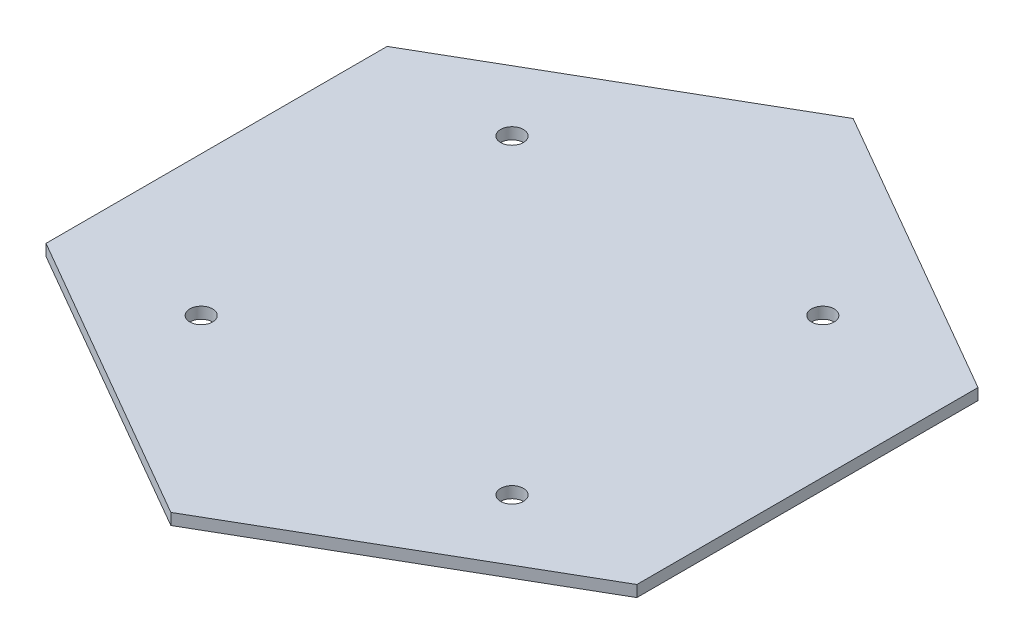
ISO-10303-21;
HEADER;
FILE_DESCRIPTION(('STEP AP214'),'2;1');
FILE_NAME('part.step','',(''),(''),'','','');
FILE_SCHEMA(('AUTOMOTIVE_DESIGN { 1 0 10303 214 1 1 1 1 }'));
ENDSEC;
DATA;
#1=APPLICATION_CONTEXT('core data for automotive mechanical design processes');
#2=APPLICATION_PROTOCOL_DEFINITION('international standard','automotive_design',2000,#1);
#3=PRODUCT_CONTEXT('',#1,'mechanical');
#4=PRODUCT('Part','Part','',(#3));
#5=PRODUCT_RELATED_PRODUCT_CATEGORY('part','',(#4));
#6=PRODUCT_DEFINITION_FORMATION('','',#4);
#7=PRODUCT_DEFINITION_CONTEXT('part definition',#1,'design');
#8=PRODUCT_DEFINITION('design','',#6,#7);
#9=PRODUCT_DEFINITION_SHAPE('','',#8);
#10=(LENGTH_UNIT() NAMED_UNIT(*) SI_UNIT(.MILLI.,.METRE.));
#11=(NAMED_UNIT(*) PLANE_ANGLE_UNIT() SI_UNIT($,.RADIAN.));
#12=(NAMED_UNIT(*) SI_UNIT($,.STERADIAN.) SOLID_ANGLE_UNIT());
#13=UNCERTAINTY_MEASURE_WITH_UNIT(LENGTH_MEASURE(1.E-05),#10,'distance_accuracy_value','');
#14=(GEOMETRIC_REPRESENTATION_CONTEXT(3) GLOBAL_UNCERTAINTY_ASSIGNED_CONTEXT((#13)) GLOBAL_UNIT_ASSIGNED_CONTEXT((#10,
#11,#12)) REPRESENTATION_CONTEXT('',''));
#15=CARTESIAN_POINT('',(0.,0.,0.));
#16=DIRECTION('',(0.,0.,1.));
#17=DIRECTION('',(1.,0.,0.));
#18=AXIS2_PLACEMENT_3D('',#15,#16,#17);
#19=CARTESIAN_POINT('',(-38.9711431702997,1.5,22.5));
#20=DIRECTION('',(0.5,0.,-0.866025403784439));
#21=DIRECTION('',(-0.866025403784439,0.,-0.5));
#22=AXIS2_PLACEMENT_3D('',#19,#20,#21);
#23=PLANE('',#22);
#24=DIRECTION('',(0.866025403784439,0.,0.5));
#25=VECTOR('',#24,1.);
#26=CARTESIAN_POINT('',(-38.9711431702997,0.,22.5));
#27=LINE('',#26,#25);
#28=CARTESIAN_POINT('',(-38.9711431702997,0.,22.5));
#29=VERTEX_POINT('',#28);
#30=CARTESIAN_POINT('',(0.,0.,45.));
#31=VERTEX_POINT('',#30);
#32=EDGE_CURVE('E123',#29,#31,#27,.T.);
#33=ORIENTED_EDGE('',*,*,#32,.T.);
#34=DIRECTION('',(0.,-1.,0.));
#35=VECTOR('',#34,1.);
#36=CARTESIAN_POINT('',(0.,1.5,45.));
#37=LINE('',#36,#35);
#38=CARTESIAN_POINT('',(0.,1.5,45.));
#39=VERTEX_POINT('',#38);
#40=EDGE_CURVE('E11',#39,#31,#37,.T.);
#41=ORIENTED_EDGE('',*,*,#40,.F.);
#42=DIRECTION('',(0.866025403784439,0.,0.5));
#43=VECTOR('',#42,1.);
#44=CARTESIAN_POINT('',(-38.9711431702997,1.5,22.5));
#45=LINE('',#44,#43);
#46=CARTESIAN_POINT('',(-38.9711431702997,1.5,22.5));
#47=VERTEX_POINT('',#46);
#48=EDGE_CURVE('E134',#47,#39,#45,.T.);
#49=ORIENTED_EDGE('',*,*,#48,.F.);
#50=DIRECTION('',(0.,-1.,0.));
#51=VECTOR('',#50,1.);
#52=CARTESIAN_POINT('',(-38.9711431702997,1.5,22.5));
#53=LINE('',#52,#51);
#54=EDGE_CURVE('E119',#47,#29,#53,.T.);
#55=ORIENTED_EDGE('',*,*,#54,.T.);
#56=EDGE_LOOP('',(#33,#41,#49,#55));
#57=FACE_BOUND('',#56,.T.);
#58=ADVANCED_FACE('F39',(#57),#23,.F.);
#59=CARTESIAN_POINT('',(0.,1.5,45.));
#60=DIRECTION('',(-0.5,0.,-0.866025403784438));
#61=DIRECTION('',(-0.866025403784438,0.,0.500000000000001));
#62=AXIS2_PLACEMENT_3D('',#59,#60,#61);
#63=PLANE('',#62);
#64=DIRECTION('',(0.866025403784438,0.,-0.500000000000001));
#65=VECTOR('',#64,1.);
#66=CARTESIAN_POINT('',(0.,0.,45.));
#67=LINE('',#66,#65);
#68=CARTESIAN_POINT('',(38.9711431702997,0.,22.5));
#69=VERTEX_POINT('',#68);
#70=EDGE_CURVE('E126',#31,#69,#67,.T.);
#71=ORIENTED_EDGE('',*,*,#70,.T.);
#72=DIRECTION('',(0.,-1.,0.));
#73=VECTOR('',#72,1.);
#74=CARTESIAN_POINT('',(38.9711431702997,1.5,22.5));
#75=LINE('',#74,#73);
#76=CARTESIAN_POINT('',(38.9711431702997,1.5,22.5));
#77=VERTEX_POINT('',#76);
#78=EDGE_CURVE('E47',#77,#69,#75,.T.);
#79=ORIENTED_EDGE('',*,*,#78,.F.);
#80=DIRECTION('',(0.866025403784438,0.,-0.500000000000001));
#81=VECTOR('',#80,1.);
#82=CARTESIAN_POINT('',(0.,1.5,45.));
#83=LINE('',#82,#81);
#84=EDGE_CURVE('E92',#39,#77,#83,.T.);
#85=ORIENTED_EDGE('',*,*,#84,.F.);
#86=ORIENTED_EDGE('',*,*,#40,.T.);
#87=EDGE_LOOP('',(#71,#79,#85,#86));
#88=FACE_BOUND('',#87,.T.);
#89=ADVANCED_FACE('F159',(#88),#63,.F.);
#90=CARTESIAN_POINT('',(38.9711431702997,1.5,22.5));
#91=DIRECTION('',(-1.,0.,0.));
#92=DIRECTION('',(0.,0.,1.));
#93=AXIS2_PLACEMENT_3D('',#90,#91,#92);
#94=PLANE('',#93);
#95=DIRECTION('',(0.,0.,-1.));
#96=VECTOR('',#95,1.);
#97=CARTESIAN_POINT('',(38.9711431702997,0.,22.5));
#98=LINE('',#97,#96);
#99=CARTESIAN_POINT('',(38.9711431702997,0.,-22.5));
#100=VERTEX_POINT('',#99);
#101=EDGE_CURVE('E129',#69,#100,#98,.T.);
#102=ORIENTED_EDGE('',*,*,#101,.T.);
#103=DIRECTION('',(0.,-1.,0.));
#104=VECTOR('',#103,1.);
#105=CARTESIAN_POINT('',(38.9711431702997,1.5,-22.5));
#106=LINE('',#105,#104);
#107=CARTESIAN_POINT('',(38.9711431702997,1.5,-22.5));
#108=VERTEX_POINT('',#107);
#109=EDGE_CURVE('E114',#108,#100,#106,.T.);
#110=ORIENTED_EDGE('',*,*,#109,.F.);
#111=DIRECTION('',(0.,0.,-1.));
#112=VECTOR('',#111,1.);
#113=CARTESIAN_POINT('',(38.9711431702997,1.5,22.5));
#114=LINE('',#113,#112);
#115=EDGE_CURVE('E105',#77,#108,#114,.T.);
#116=ORIENTED_EDGE('',*,*,#115,.F.);
#117=ORIENTED_EDGE('',*,*,#78,.T.);
#118=EDGE_LOOP('',(#102,#110,#116,#117));
#119=FACE_BOUND('',#118,.T.);
#120=ADVANCED_FACE('F140',(#119),#94,.F.);
#121=CARTESIAN_POINT('',(38.9711431702997,1.5,-22.5));
#122=DIRECTION('',(-0.5,0.,0.866025403784439));
#123=DIRECTION('',(0.866025403784439,0.,0.5));
#124=AXIS2_PLACEMENT_3D('',#121,#122,#123);
#125=PLANE('',#124);
#126=DIRECTION('',(-0.866025403784439,0.,-0.5));
#127=VECTOR('',#126,1.);
#128=CARTESIAN_POINT('',(38.9711431702997,0.,-22.5));
#129=LINE('',#128,#127);
#130=CARTESIAN_POINT('',(0.,0.,-45.));
#131=VERTEX_POINT('',#130);
#132=EDGE_CURVE('E113',#100,#131,#129,.T.);
#133=ORIENTED_EDGE('',*,*,#132,.T.);
#134=DIRECTION('',(0.,-1.,0.));
#135=VECTOR('',#134,1.);
#136=CARTESIAN_POINT('',(0.,1.5,-45.));
#137=LINE('',#136,#135);
#138=CARTESIAN_POINT('',(0.,1.5,-45.));
#139=VERTEX_POINT('',#138);
#140=EDGE_CURVE('E110',#139,#131,#137,.T.);
#141=ORIENTED_EDGE('',*,*,#140,.F.);
#142=DIRECTION('',(-0.866025403784439,0.,-0.5));
#143=VECTOR('',#142,1.);
#144=CARTESIAN_POINT('',(38.9711431702997,1.5,-22.5));
#145=LINE('',#144,#143);
#146=EDGE_CURVE('E99',#108,#139,#145,.T.);
#147=ORIENTED_EDGE('',*,*,#146,.F.);
#148=ORIENTED_EDGE('',*,*,#109,.T.);
#149=EDGE_LOOP('',(#133,#141,#147,#148));
#150=FACE_BOUND('',#149,.T.);
#151=ADVANCED_FACE('F111',(#150),#125,.F.);
#152=CARTESIAN_POINT('',(0.,1.5,-45.));
#153=DIRECTION('',(0.500000000000001,0.,0.866025403784438));
#154=DIRECTION('',(0.866025403784438,0.,-0.500000000000001));
#155=AXIS2_PLACEMENT_3D('',#152,#153,#154);
#156=PLANE('',#155);
#157=DIRECTION('',(-0.866025403784438,0.,0.5));
#158=VECTOR('',#157,1.);
#159=CARTESIAN_POINT('',(0.,0.,-45.));
#160=LINE('',#159,#158);
#161=CARTESIAN_POINT('',(-38.9711431702997,0.,-22.5));
#162=VERTEX_POINT('',#161);
#163=EDGE_CURVE('E78',#131,#162,#160,.T.);
#164=ORIENTED_EDGE('',*,*,#163,.T.);
#165=DIRECTION('',(0.,-1.,0.));
#166=VECTOR('',#165,1.);
#167=CARTESIAN_POINT('',(-38.9711431702997,1.5,-22.5));
#168=LINE('',#167,#166);
#169=CARTESIAN_POINT('',(-38.9711431702997,1.5,-22.5));
#170=VERTEX_POINT('',#169);
#171=EDGE_CURVE('E115',#170,#162,#168,.T.);
#172=ORIENTED_EDGE('',*,*,#171,.F.);
#173=DIRECTION('',(-0.866025403784438,0.,0.5));
#174=VECTOR('',#173,1.);
#175=CARTESIAN_POINT('',(0.,1.5,-45.));
#176=LINE('',#175,#174);
#177=EDGE_CURVE('E103',#139,#170,#176,.T.);
#178=ORIENTED_EDGE('',*,*,#177,.F.);
#179=ORIENTED_EDGE('',*,*,#140,.T.);
#180=EDGE_LOOP('',(#164,#172,#178,#179));
#181=FACE_BOUND('',#180,.T.);
#182=ADVANCED_FACE('F117',(#181),#156,.F.);
#183=CARTESIAN_POINT('',(-38.9711431702997,1.5,-22.5));
#184=DIRECTION('',(1.,0.,0.));
#185=DIRECTION('',(0.,0.,-1.));
#186=AXIS2_PLACEMENT_3D('',#183,#184,#185);
#187=PLANE('',#186);
#188=DIRECTION('',(0.,0.,1.));
#189=VECTOR('',#188,1.);
#190=CARTESIAN_POINT('',(-38.9711431702997,0.,-22.5));
#191=LINE('',#190,#189);
#192=EDGE_CURVE('E84',#162,#29,#191,.T.);
#193=ORIENTED_EDGE('',*,*,#192,.T.);
#194=ORIENTED_EDGE('',*,*,#54,.F.);
#195=DIRECTION('',(0.,0.,1.));
#196=VECTOR('',#195,1.);
#197=CARTESIAN_POINT('',(-38.9711431702997,1.5,-22.5));
#198=LINE('',#197,#196);
#199=EDGE_CURVE('E55',#170,#47,#198,.T.);
#200=ORIENTED_EDGE('',*,*,#199,.F.);
#201=ORIENTED_EDGE('',*,*,#171,.T.);
#202=EDGE_LOOP('',(#193,#194,#200,#201));
#203=FACE_BOUND('',#202,.T.);
#204=ADVANCED_FACE('F147',(#203),#187,.F.);
#205=CARTESIAN_POINT('',(0.,1.5,0.));
#206=DIRECTION('',(0.,1.,0.));
#207=DIRECTION('',(0.,0.,1.));
#208=AXIS2_PLACEMENT_3D('',#205,#206,#207);
#209=PLANE('',#208);
#210=CARTESIAN_POINT('',(-20.5,1.5,-20.5));
#211=DIRECTION('',(0.,1.,0.));
#212=DIRECTION('',(0.,0.,-1.));
#213=AXIS2_PLACEMENT_3D('',#210,#211,#212);
#214=CIRCLE('',#213,1.5);
#215=CARTESIAN_POINT('',(-20.5,1.5,-22.));
#216=VERTEX_POINT('',#215);
#217=EDGE_CURVE('E246',#216,#216,#214,.T.);
#218=ORIENTED_EDGE('',*,*,#217,.F.);
#219=EDGE_LOOP('',(#218));
#220=FACE_BOUND('',#219,.T.);
#221=CARTESIAN_POINT('',(-20.5,1.5,20.5));
#222=DIRECTION('',(0.,1.,0.));
#223=DIRECTION('',(0.,0.,1.));
#224=AXIS2_PLACEMENT_3D('',#221,#222,#223);
#225=CIRCLE('',#224,1.5);
#226=CARTESIAN_POINT('',(-20.5,1.5,22.));
#227=VERTEX_POINT('',#226);
#228=EDGE_CURVE('E250',#227,#227,#225,.T.);
#229=ORIENTED_EDGE('',*,*,#228,.F.);
#230=EDGE_LOOP('',(#229));
#231=FACE_BOUND('',#230,.T.);
#232=CARTESIAN_POINT('',(20.5,1.5,20.5));
#233=DIRECTION('',(0.,1.,0.));
#234=DIRECTION('',(0.,0.,-1.));
#235=AXIS2_PLACEMENT_3D('',#232,#233,#234);
#236=CIRCLE('',#235,1.5);
#237=CARTESIAN_POINT('',(20.5,1.5,19.));
#238=VERTEX_POINT('',#237);
#239=EDGE_CURVE('E260',#238,#238,#236,.T.);
#240=ORIENTED_EDGE('',*,*,#239,.F.);
#241=EDGE_LOOP('',(#240));
#242=FACE_BOUND('',#241,.T.);
#243=CARTESIAN_POINT('',(20.5,1.5,-20.5));
#244=DIRECTION('',(0.,1.,0.));
#245=DIRECTION('',(0.,0.,1.));
#246=AXIS2_PLACEMENT_3D('',#243,#244,#245);
#247=CIRCLE('',#246,1.5);
#248=CARTESIAN_POINT('',(20.5,1.5,-19.));
#249=VERTEX_POINT('',#248);
#250=EDGE_CURVE('E257',#249,#249,#247,.T.);
#251=ORIENTED_EDGE('',*,*,#250,.F.);
#252=EDGE_LOOP('',(#251));
#253=FACE_BOUND('',#252,.T.);
#254=ORIENTED_EDGE('',*,*,#48,.T.);
#255=ORIENTED_EDGE('',*,*,#84,.T.);
#256=ORIENTED_EDGE('',*,*,#115,.T.);
#257=ORIENTED_EDGE('',*,*,#146,.T.);
#258=ORIENTED_EDGE('',*,*,#177,.T.);
#259=ORIENTED_EDGE('',*,*,#199,.T.);
#260=EDGE_LOOP('',(#254,#255,#256,#257,#258,#259));
#261=FACE_BOUND('',#260,.T.);
#262=ADVANCED_FACE('F101',(#220,#231,#242,#253,#261),#209,.T.);
#263=CARTESIAN_POINT('',(0.,0.,0.));
#264=DIRECTION('',(0.,1.,0.));
#265=DIRECTION('',(0.,0.,1.));
#266=AXIS2_PLACEMENT_3D('',#263,#264,#265);
#267=PLANE('',#266);
#268=CARTESIAN_POINT('',(-20.5,0.,-20.5));
#269=DIRECTION('',(0.,1.,0.));
#270=DIRECTION('',(0.,0.,-1.));
#271=AXIS2_PLACEMENT_3D('',#268,#269,#270);
#272=CIRCLE('',#271,1.5);
#273=CARTESIAN_POINT('',(-20.5,0.,-22.));
#274=VERTEX_POINT('',#273);
#275=EDGE_CURVE('E243',#274,#274,#272,.T.);
#276=ORIENTED_EDGE('',*,*,#275,.T.);
#277=EDGE_LOOP('',(#276));
#278=FACE_BOUND('',#277,.T.);
#279=CARTESIAN_POINT('',(-20.5,0.,20.5));
#280=DIRECTION('',(0.,1.,0.));
#281=DIRECTION('',(0.,0.,1.));
#282=AXIS2_PLACEMENT_3D('',#279,#280,#281);
#283=CIRCLE('',#282,1.5);
#284=CARTESIAN_POINT('',(-20.5,0.,22.));
#285=VERTEX_POINT('',#284);
#286=EDGE_CURVE('E247',#285,#285,#283,.T.);
#287=ORIENTED_EDGE('',*,*,#286,.T.);
#288=EDGE_LOOP('',(#287));
#289=FACE_BOUND('',#288,.T.);
#290=CARTESIAN_POINT('',(20.5,0.,20.5));
#291=DIRECTION('',(0.,1.,0.));
#292=DIRECTION('',(0.,0.,-1.));
#293=AXIS2_PLACEMENT_3D('',#290,#291,#292);
#294=CIRCLE('',#293,1.5);
#295=CARTESIAN_POINT('',(20.5,0.,19.));
#296=VERTEX_POINT('',#295);
#297=EDGE_CURVE('E265',#296,#296,#294,.T.);
#298=ORIENTED_EDGE('',*,*,#297,.T.);
#299=EDGE_LOOP('',(#298));
#300=FACE_BOUND('',#299,.T.);
#301=CARTESIAN_POINT('',(20.5,0.,-20.5));
#302=DIRECTION('',(0.,1.,0.));
#303=DIRECTION('',(0.,0.,1.));
#304=AXIS2_PLACEMENT_3D('',#301,#302,#303);
#305=CIRCLE('',#304,1.5);
#306=CARTESIAN_POINT('',(20.5,0.,-19.));
#307=VERTEX_POINT('',#306);
#308=EDGE_CURVE('E127',#307,#307,#305,.T.);
#309=ORIENTED_EDGE('',*,*,#308,.T.);
#310=EDGE_LOOP('',(#309));
#311=FACE_BOUND('',#310,.T.);
#312=ORIENTED_EDGE('',*,*,#32,.F.);
#313=ORIENTED_EDGE('',*,*,#192,.F.);
#314=ORIENTED_EDGE('',*,*,#163,.F.);
#315=ORIENTED_EDGE('',*,*,#132,.F.);
#316=ORIENTED_EDGE('',*,*,#101,.F.);
#317=ORIENTED_EDGE('',*,*,#70,.F.);
#318=EDGE_LOOP('',(#312,#313,#314,#315,#316,#317));
#319=FACE_BOUND('',#318,.T.);
#320=ADVANCED_FACE('F143',(#278,#289,#300,#311,#319),#267,.F.);
#321=CARTESIAN_POINT('',(20.5,0.,-20.5));
#322=DIRECTION('',(0.,1.,0.));
#323=DIRECTION('',(0.,0.,1.));
#324=AXIS2_PLACEMENT_3D('',#321,#322,#323);
#325=CYLINDRICAL_SURFACE('',#324,1.5);
#326=ORIENTED_EDGE('',*,*,#308,.F.);
#327=EDGE_LOOP('',(#326));
#328=FACE_BOUND('',#327,.T.);
#329=ORIENTED_EDGE('',*,*,#250,.T.);
#330=EDGE_LOOP('',(#329));
#331=FACE_BOUND('',#330,.T.);
#332=ADVANCED_FACE('F198',(#328,#331),#325,.F.);
#333=CARTESIAN_POINT('',(20.5,0.,20.5));
#334=DIRECTION('',(0.,1.,0.));
#335=DIRECTION('',(0.,0.,1.));
#336=AXIS2_PLACEMENT_3D('',#333,#334,#335);
#337=CYLINDRICAL_SURFACE('',#336,1.5);
#338=ORIENTED_EDGE('',*,*,#297,.F.);
#339=EDGE_LOOP('',(#338));
#340=FACE_BOUND('',#339,.T.);
#341=ORIENTED_EDGE('',*,*,#239,.T.);
#342=EDGE_LOOP('',(#341));
#343=FACE_BOUND('',#342,.T.);
#344=ADVANCED_FACE('F207',(#340,#343),#337,.F.);
#345=CARTESIAN_POINT('',(-20.5,0.,20.5));
#346=DIRECTION('',(0.,1.,0.));
#347=DIRECTION('',(0.,0.,1.));
#348=AXIS2_PLACEMENT_3D('',#345,#346,#347);
#349=CYLINDRICAL_SURFACE('',#348,1.5);
#350=ORIENTED_EDGE('',*,*,#286,.F.);
#351=EDGE_LOOP('',(#350));
#352=FACE_BOUND('',#351,.T.);
#353=ORIENTED_EDGE('',*,*,#228,.T.);
#354=EDGE_LOOP('',(#353));
#355=FACE_BOUND('',#354,.T.);
#356=ADVANCED_FACE('F217',(#352,#355),#349,.F.);
#357=CARTESIAN_POINT('',(-20.5,0.,-20.5));
#358=DIRECTION('',(0.,1.,0.));
#359=DIRECTION('',(0.,0.,1.));
#360=AXIS2_PLACEMENT_3D('',#357,#358,#359);
#361=CYLINDRICAL_SURFACE('',#360,1.5);
#362=ORIENTED_EDGE('',*,*,#275,.F.);
#363=EDGE_LOOP('',(#362));
#364=FACE_BOUND('',#363,.T.);
#365=ORIENTED_EDGE('',*,*,#217,.T.);
#366=EDGE_LOOP('',(#365));
#367=FACE_BOUND('',#366,.T.);
#368=ADVANCED_FACE('F227',(#364,#367),#361,.F.);
#369=CLOSED_SHELL('',(#58,#89,#120,#151,#182,#204,#262,#320,#332,#344,#356,#368));
#370=MANIFOLD_SOLID_BREP('B2',#369);
#371=ADVANCED_BREP_SHAPE_REPRESENTATION('',(#18,#370),#14);
#372=SHAPE_DEFINITION_REPRESENTATION(#9,#371);
ENDSEC;
END-ISO-10303-21;
